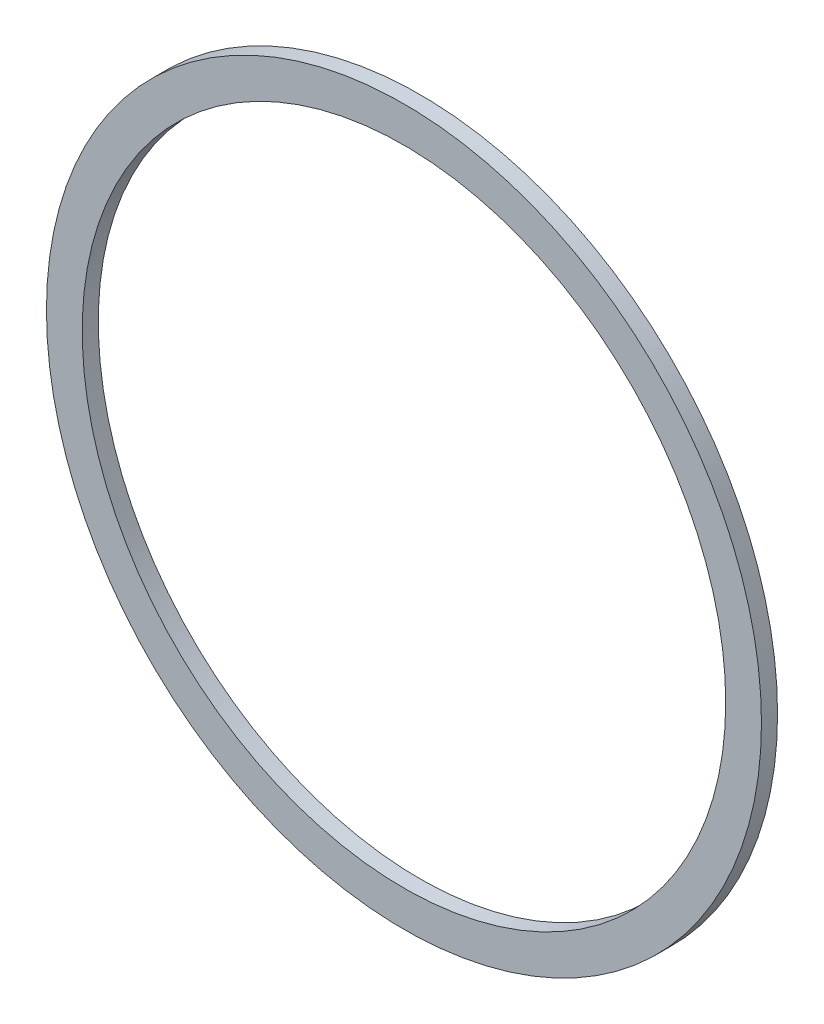
ISO-10303-21;
HEADER;
FILE_DESCRIPTION(('STEP AP214'),'2;1');
FILE_NAME('part.step','',(''),(''),'','','');
FILE_SCHEMA(('AUTOMOTIVE_DESIGN { 1 0 10303 214 1 1 1 1 }'));
ENDSEC;
DATA;
#1=APPLICATION_CONTEXT('core data for automotive mechanical design processes');
#2=APPLICATION_PROTOCOL_DEFINITION('international standard','automotive_design',2000,#1);
#3=PRODUCT_CONTEXT('',#1,'mechanical');
#4=PRODUCT('Part','Part','',(#3));
#5=PRODUCT_RELATED_PRODUCT_CATEGORY('part','',(#4));
#6=PRODUCT_DEFINITION_FORMATION('','',#4);
#7=PRODUCT_DEFINITION_CONTEXT('part definition',#1,'design');
#8=PRODUCT_DEFINITION('design','',#6,#7);
#9=PRODUCT_DEFINITION_SHAPE('','',#8);
#10=(LENGTH_UNIT() NAMED_UNIT(*) SI_UNIT(.MILLI.,.METRE.));
#11=(NAMED_UNIT(*) PLANE_ANGLE_UNIT() SI_UNIT($,.RADIAN.));
#12=(NAMED_UNIT(*) SI_UNIT($,.STERADIAN.) SOLID_ANGLE_UNIT());
#13=UNCERTAINTY_MEASURE_WITH_UNIT(LENGTH_MEASURE(1.E-05),#10,'distance_accuracy_value','');
#14=(GEOMETRIC_REPRESENTATION_CONTEXT(3) GLOBAL_UNCERTAINTY_ASSIGNED_CONTEXT((#13)) GLOBAL_UNIT_ASSIGNED_CONTEXT((#10,
#11,#12)) REPRESENTATION_CONTEXT('',''));
#15=CARTESIAN_POINT('',(0.,0.,0.));
#16=DIRECTION('',(0.,0.,1.));
#17=DIRECTION('',(1.,0.,0.));
#18=AXIS2_PLACEMENT_3D('',#15,#16,#17);
#19=CARTESIAN_POINT('',(0.,0.,1.8));
#20=DIRECTION('',(0.,0.,1.));
#21=DIRECTION('',(1.,0.,0.));
#22=AXIS2_PLACEMENT_3D('',#19,#20,#21);
#23=PLANE('',#22);
#24=CARTESIAN_POINT('',(0.,0.,1.8));
#25=DIRECTION('',(0.,0.,1.));
#26=DIRECTION('',(1.,0.,0.));
#27=AXIS2_PLACEMENT_3D('',#24,#25,#26);
#28=CIRCLE('',#27,40.);
#29=CARTESIAN_POINT('',(40.,0.,1.8));
#30=VERTEX_POINT('',#29);
#31=EDGE_CURVE('E10',#30,#30,#28,.T.);
#32=ORIENTED_EDGE('',*,*,#31,.T.);
#33=EDGE_LOOP('',(#32));
#34=FACE_BOUND('',#33,.T.);
#35=CARTESIAN_POINT('',(0.,0.,1.8));
#36=DIRECTION('',(0.,0.,1.));
#37=DIRECTION('',(1.,0.,0.));
#38=AXIS2_PLACEMENT_3D('',#35,#36,#37);
#39=CIRCLE('',#38,36.);
#40=CARTESIAN_POINT('',(36.,0.,1.8));
#41=VERTEX_POINT('',#40);
#42=EDGE_CURVE('E56',#41,#41,#39,.T.);
#43=ORIENTED_EDGE('',*,*,#42,.F.);
#44=EDGE_LOOP('',(#43));
#45=FACE_BOUND('',#44,.T.);
#46=ADVANCED_FACE('F43',(#34,#45),#23,.T.);
#47=CARTESIAN_POINT('',(0.,0.,0.));
#48=DIRECTION('',(0.,0.,1.));
#49=DIRECTION('',(1.,0.,0.));
#50=AXIS2_PLACEMENT_3D('',#47,#48,#49);
#51=PLANE('',#50);
#52=CARTESIAN_POINT('',(0.,0.,0.));
#53=DIRECTION('',(0.,0.,1.));
#54=DIRECTION('',(1.,0.,0.));
#55=AXIS2_PLACEMENT_3D('',#52,#53,#54);
#56=CIRCLE('',#55,40.);
#57=CARTESIAN_POINT('',(40.,0.,0.));
#58=VERTEX_POINT('',#57);
#59=EDGE_CURVE('E47',#58,#58,#56,.T.);
#60=ORIENTED_EDGE('',*,*,#59,.F.);
#61=EDGE_LOOP('',(#60));
#62=FACE_BOUND('',#61,.T.);
#63=CARTESIAN_POINT('',(0.,0.,0.));
#64=DIRECTION('',(0.,0.,1.));
#65=DIRECTION('',(1.,0.,0.));
#66=AXIS2_PLACEMENT_3D('',#63,#64,#65);
#67=CIRCLE('',#66,36.);
#68=CARTESIAN_POINT('',(36.,0.,0.));
#69=VERTEX_POINT('',#68);
#70=EDGE_CURVE('E58',#69,#69,#67,.T.);
#71=ORIENTED_EDGE('',*,*,#70,.T.);
#72=EDGE_LOOP('',(#71));
#73=FACE_BOUND('',#72,.T.);
#74=ADVANCED_FACE('F70',(#62,#73),#51,.F.);
#75=CARTESIAN_POINT('',(0.,0.,1.8));
#76=DIRECTION('',(0.,0.,-1.));
#77=DIRECTION('',(-1.,0.,0.));
#78=AXIS2_PLACEMENT_3D('',#75,#76,#77);
#79=CYLINDRICAL_SURFACE('',#78,40.);
#80=ORIENTED_EDGE('',*,*,#31,.F.);
#81=EDGE_LOOP('',(#80));
#82=FACE_BOUND('',#81,.T.);
#83=ORIENTED_EDGE('',*,*,#59,.T.);
#84=EDGE_LOOP('',(#83));
#85=FACE_BOUND('',#84,.T.);
#86=ADVANCED_FACE('F45',(#82,#85),#79,.T.);
#87=CARTESIAN_POINT('',(0.,0.,1.8));
#88=DIRECTION('',(0.,0.,-1.));
#89=DIRECTION('',(-1.,0.,0.));
#90=AXIS2_PLACEMENT_3D('',#87,#88,#89);
#91=CYLINDRICAL_SURFACE('',#90,36.);
#92=ORIENTED_EDGE('',*,*,#42,.T.);
#93=EDGE_LOOP('',(#92));
#94=FACE_BOUND('',#93,.T.);
#95=ORIENTED_EDGE('',*,*,#70,.F.);
#96=EDGE_LOOP('',(#95));
#97=FACE_BOUND('',#96,.T.);
#98=ADVANCED_FACE('F66',(#94,#97),#91,.F.);
#99=CLOSED_SHELL('',(#46,#74,#86,#98));
#100=MANIFOLD_SOLID_BREP('B2',#99);
#101=ADVANCED_BREP_SHAPE_REPRESENTATION('',(#18,#100),#14);
#102=SHAPE_DEFINITION_REPRESENTATION(#9,#101);
ENDSEC;
END-ISO-10303-21;
